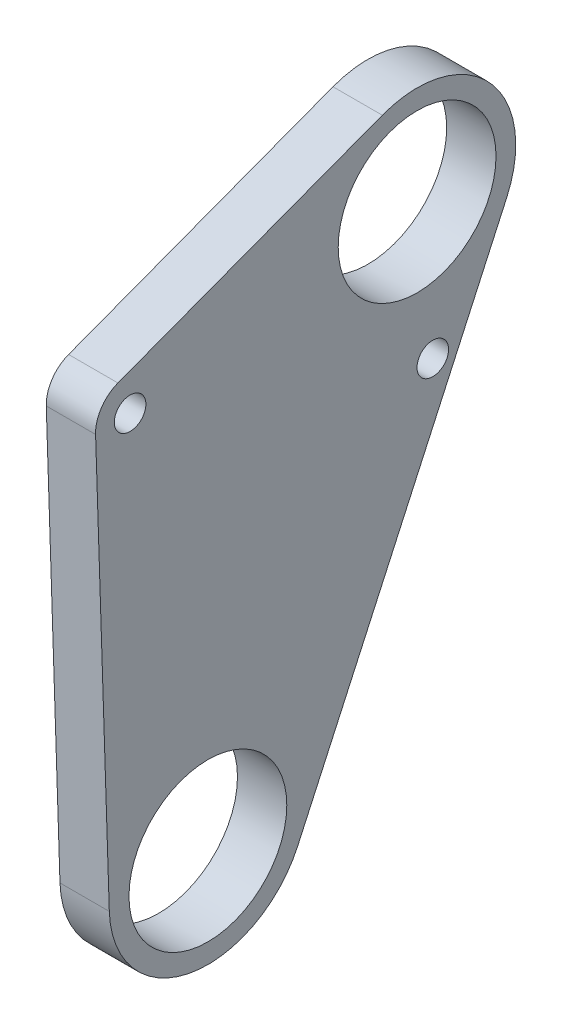
ISO-10303-21;
HEADER;
FILE_DESCRIPTION(('STEP AP214'),'2;1');
FILE_NAME('part.step','',(''),(''),'','','');
FILE_SCHEMA(('AUTOMOTIVE_DESIGN { 1 0 10303 214 1 1 1 1 }'));
ENDSEC;
DATA;
#1=APPLICATION_CONTEXT('core data for automotive mechanical design processes');
#2=APPLICATION_PROTOCOL_DEFINITION('international standard','automotive_design',2000,#1);
#3=PRODUCT_CONTEXT('',#1,'mechanical');
#4=PRODUCT('Part','Part','',(#3));
#5=PRODUCT_RELATED_PRODUCT_CATEGORY('part','',(#4));
#6=PRODUCT_DEFINITION_FORMATION('','',#4);
#7=PRODUCT_DEFINITION_CONTEXT('part definition',#1,'design');
#8=PRODUCT_DEFINITION('design','',#6,#7);
#9=PRODUCT_DEFINITION_SHAPE('','',#8);
#10=(LENGTH_UNIT() NAMED_UNIT(*) SI_UNIT(.MILLI.,.METRE.));
#11=(NAMED_UNIT(*) PLANE_ANGLE_UNIT() SI_UNIT($,.RADIAN.));
#12=(NAMED_UNIT(*) SI_UNIT($,.STERADIAN.) SOLID_ANGLE_UNIT());
#13=UNCERTAINTY_MEASURE_WITH_UNIT(LENGTH_MEASURE(1.E-05),#10,'distance_accuracy_value','');
#14=(GEOMETRIC_REPRESENTATION_CONTEXT(3) GLOBAL_UNCERTAINTY_ASSIGNED_CONTEXT((#13)) GLOBAL_UNIT_ASSIGNED_CONTEXT((#10,
#11,#12)) REPRESENTATION_CONTEXT('',''));
#15=CARTESIAN_POINT('',(0.,0.,0.));
#16=DIRECTION('',(0.,0.,1.));
#17=DIRECTION('',(1.,0.,0.));
#18=AXIS2_PLACEMENT_3D('',#15,#16,#17);
#19=CARTESIAN_POINT('',(-16.3,0.,0.));
#20=DIRECTION('',(-1.,0.,0.));
#21=DIRECTION('',(0.,0.,1.));
#22=AXIS2_PLACEMENT_3D('',#19,#20,#21);
#23=PLANE('',#22);
#24=CARTESIAN_POINT('',(-16.3,-46.3798085110589,21.2111612713096));
#25=DIRECTION('',(-1.,0.,0.));
#26=DIRECTION('',(0.,0.,1.));
#27=AXIS2_PLACEMENT_3D('',#24,#25,#26);
#28=CIRCLE('',#27,8.00000000000001);
#29=CARTESIAN_POINT('',(-16.3,-46.3798085110589,29.2111612713096));
#30=VERTEX_POINT('',#29);
#31=EDGE_CURVE('E65',#30,#30,#28,.F.);
#32=ORIENTED_EDGE('',*,*,#31,.F.);
#33=EDGE_LOOP('',(#32));
#34=FACE_BOUND('',#33,.T.);
#35=CARTESIAN_POINT('',(-16.3,0.,0.));
#36=DIRECTION('',(-1.,0.,0.));
#37=DIRECTION('',(0.,0.,1.));
#38=AXIS2_PLACEMENT_3D('',#35,#36,#37);
#39=CIRCLE('',#38,8.00000000000078);
#40=CARTESIAN_POINT('',(-16.3,0.,8.00000000000078));
#41=VERTEX_POINT('',#40);
#42=EDGE_CURVE('E265',#41,#41,#39,.F.);
#43=ORIENTED_EDGE('',*,*,#42,.F.);
#44=EDGE_LOOP('',(#43));
#45=FACE_BOUND('',#44,.T.);
#46=CARTESIAN_POINT('',(-16.3,0.,0.));
#47=DIRECTION('',(-1.,0.,0.));
#48=DIRECTION('',(0.,0.,1.));
#49=AXIS2_PLACEMENT_3D('',#46,#47,#48);
#50=CIRCLE('',#49,10.0000000000004);
#51=CARTESIAN_POINT('',(-16.3,-4.15905122966853,-9.09408010020763));
#52=VERTEX_POINT('',#51);
#53=CARTESIAN_POINT('',(-16.3,9.3573851667248,3.52694525638814));
#54=VERTEX_POINT('',#53);
#55=EDGE_CURVE('E259',#52,#54,#50,.F.);
#56=ORIENTED_EDGE('',*,*,#55,.T.);
#57=DIRECTION('',(0.,-0.352694525638813,0.93573851667248));
#58=VECTOR('',#57,1.);
#59=CARTESIAN_POINT('',(-16.3,9.3573851667248,3.52694525638814));
#60=LINE('',#59,#58);
#61=CARTESIAN_POINT('',(-16.3,-0.745905163491184,30.3321186283995));
#62=VERTEX_POINT('',#61);
#63=EDGE_CURVE('E70',#54,#62,#60,.T.);
#64=ORIENTED_EDGE('',*,*,#63,.T.);
#65=CARTESIAN_POINT('',(-16.3,-4.02098997184533,29.0976877886635));
#66=DIRECTION('',(-1.,0.,0.));
#67=DIRECTION('',(0.,0.,1.));
#68=AXIS2_PLACEMENT_3D('',#65,#66,#67);
#69=CIRCLE('',#68,3.50000000000049);
#70=CARTESIAN_POINT('',(-16.3,-4.13520800486961,32.5958236123467));
#71=VERTEX_POINT('',#70);
#72=EDGE_CURVE('E12',#62,#71,#69,.F.);
#73=ORIENTED_EDGE('',*,*,#72,.T.);
#74=DIRECTION('',(0.,0.99946737819505,0.0326337237212191));
#75=VECTOR('',#74,1.);
#76=CARTESIAN_POINT('',(-16.3,-1.06756037091446,32.6959857262331));
#77=LINE('',#76,#75);
#78=CARTESIAN_POINT('',(-16.3,-46.7061457482711,31.2058350532601));
#79=VERTEX_POINT('',#78);
#80=EDGE_CURVE('E84',#79,#71,#77,.T.);
#81=ORIENTED_EDGE('',*,*,#80,.F.);
#82=CARTESIAN_POINT('',(-16.3,-46.3798085110589,21.2111612713096));
#83=DIRECTION('',(-1.,0.,0.));
#84=DIRECTION('',(0.,0.,1.));
#85=AXIS2_PLACEMENT_3D('',#82,#83,#84);
#86=CIRCLE('',#85,10.);
#87=CARTESIAN_POINT('',(-16.3,-50.5388597407275,12.1170811711019));
#88=VERTEX_POINT('',#87);
#89=EDGE_CURVE('E262',#79,#88,#86,.F.);
#90=ORIENTED_EDGE('',*,*,#89,.T.);
#91=DIRECTION('',(0.,-0.909408010020764,0.415905122966855));
#92=VECTOR('',#91,1.);
#93=CARTESIAN_POINT('',(-16.3,-4.15905122966854,-9.09408010020762));
#94=LINE('',#93,#92);
#95=EDGE_CURVE('E257',#52,#88,#94,.T.);
#96=ORIENTED_EDGE('',*,*,#95,.F.);
#97=EDGE_LOOP('',(#56,#64,#73,#81,#90,#96));
#98=FACE_BOUND('',#97,.T.);
#99=CARTESIAN_POINT('',(-16.3,-4.02098997184533,29.0976877886635));
#100=DIRECTION('',(-1.,0.,0.));
#101=DIRECTION('',(0.,0.,1.));
#102=AXIS2_PLACEMENT_3D('',#99,#100,#101);
#103=CIRCLE('',#102,1.59999999999999);
#104=CARTESIAN_POINT('',(-16.3,-4.02098997184533,30.6976877886635));
#105=VERTEX_POINT('',#104);
#106=EDGE_CURVE('E253',#105,#105,#103,.F.);
#107=ORIENTED_EDGE('',*,*,#106,.F.);
#108=EDGE_LOOP('',(#107));
#109=FACE_BOUND('',#108,.T.);
#110=CARTESIAN_POINT('',(-16.3,-14.554297085467,-1.59091767944725));
#111=DIRECTION('',(-1.,0.,0.));
#112=DIRECTION('',(0.,0.,1.));
#113=AXIS2_PLACEMENT_3D('',#110,#111,#112);
#114=CIRCLE('',#113,1.6);
#115=CARTESIAN_POINT('',(-16.3,-14.554297085467,0.00908232055274634));
#116=VERTEX_POINT('',#115);
#117=EDGE_CURVE('E248',#116,#116,#114,.F.);
#118=ORIENTED_EDGE('',*,*,#117,.F.);
#119=EDGE_LOOP('',(#118));
#120=FACE_BOUND('',#119,.T.);
#121=ADVANCED_FACE('F62',(#34,#45,#98,#109,#120),#23,.F.);
#122=CARTESIAN_POINT('',(-20.3,-16.4542478421911,0.471947030409549));
#123=DIRECTION('',(-1.,0.,0.));
#124=DIRECTION('',(0.,0.,-1.));
#125=AXIS2_PLACEMENT_3D('',#122,#123,#124);
#126=CYLINDRICAL_SURFACE('',#125,2.);
#127=CARTESIAN_POINT('',(-21.3,-16.4542478421911,0.471947030409549));
#128=DIRECTION('',(1.,0.,0.));
#129=DIRECTION('',(0.,0.,-1.));
#130=AXIS2_PLACEMENT_3D('',#127,#128,#129);
#131=CIRCLE('',#130,2.);
#132=CARTESIAN_POINT('',(-21.3,-14.5799720351289,1.16986550635146));
#133=VERTEX_POINT('',#132);
#134=CARTESIAN_POINT('',(-21.3,-18.3285236492534,-0.225971445532369));
#135=VERTEX_POINT('',#134);
#136=EDGE_CURVE('E167',#133,#135,#131,.T.);
#137=ORIENTED_EDGE('',*,*,#136,.F.);
#138=DIRECTION('',(-1.,0.,0.));
#139=VECTOR('',#138,1.);
#140=CARTESIAN_POINT('',(-20.3,-14.5799720351289,1.16986550635146));
#141=LINE('',#140,#139);
#142=CARTESIAN_POINT('',(-20.3,-14.5799720351289,1.16986550635146));
#143=VERTEX_POINT('',#142);
#144=EDGE_CURVE('E164',#143,#133,#141,.T.);
#145=ORIENTED_EDGE('',*,*,#144,.F.);
#146=CARTESIAN_POINT('',(-20.3,-16.4542478421911,0.471947030409549));
#147=DIRECTION('',(1.,0.,0.));
#148=DIRECTION('',(0.,0.,-1.));
#149=AXIS2_PLACEMENT_3D('',#146,#147,#148);
#150=CIRCLE('',#149,2.);
#151=CARTESIAN_POINT('',(-20.3,-18.3285236492534,-0.225971445532369));
#152=VERTEX_POINT('',#151);
#153=EDGE_CURVE('E151',#143,#152,#150,.T.);
#154=ORIENTED_EDGE('',*,*,#153,.T.);
#155=DIRECTION('',(-1.,0.,0.));
#156=VECTOR('',#155,1.);
#157=CARTESIAN_POINT('',(-20.3,-18.3285236492534,-0.225971445532369));
#158=LINE('',#157,#156);
#159=EDGE_CURVE('E171',#152,#135,#158,.T.);
#160=ORIENTED_EDGE('',*,*,#159,.T.);
#161=EDGE_LOOP('',(#137,#145,#154,#160));
#162=FACE_BOUND('',#161,.T.);
#163=ADVANCED_FACE('F165',(#162),#126,.F.);
#164=CARTESIAN_POINT('',(-20.3,-11.7511780450292,-1.67893662220493));
#165=DIRECTION('',(-1.,0.,0.));
#166=DIRECTION('',(0.,0.,-1.));
#167=AXIS2_PLACEMENT_3D('',#164,#165,#166);
#168=CYLINDRICAL_SURFACE('',#167,2.);
#169=CARTESIAN_POINT('',(-21.3,-11.7511780450292,-1.67893662220493));
#170=DIRECTION('',(1.,0.,0.));
#171=DIRECTION('',(0.,0.,-1.));
#172=AXIS2_PLACEMENT_3D('',#169,#170,#171);
#173=CIRCLE('',#172,2.);
#174=CARTESIAN_POINT('',(-21.3,-12.4490965209711,0.195339184857335));
#175=VERTEX_POINT('',#174);
#176=CARTESIAN_POINT('',(-21.3,-11.0532595690873,-3.5532124292672));
#177=VERTEX_POINT('',#176);
#178=EDGE_CURVE('E176',#175,#177,#173,.F.);
#179=ORIENTED_EDGE('',*,*,#178,.T.);
#180=DIRECTION('',(-1.,0.,0.));
#181=VECTOR('',#180,1.);
#182=CARTESIAN_POINT('',(-20.3,-11.0532595690873,-3.5532124292672));
#183=LINE('',#182,#181);
#184=CARTESIAN_POINT('',(-20.3,-11.0532595690873,-3.5532124292672));
#185=VERTEX_POINT('',#184);
#186=EDGE_CURVE('E201',#185,#177,#183,.T.);
#187=ORIENTED_EDGE('',*,*,#186,.F.);
#188=CARTESIAN_POINT('',(-20.3,-11.7511780450292,-1.67893662220493));
#189=DIRECTION('',(1.,0.,0.));
#190=DIRECTION('',(0.,0.,-1.));
#191=AXIS2_PLACEMENT_3D('',#188,#189,#190);
#192=CIRCLE('',#191,2.);
#193=CARTESIAN_POINT('',(-20.3,-12.4490965209711,0.195339184857335));
#194=VERTEX_POINT('',#193);
#195=EDGE_CURVE('E172',#194,#185,#192,.F.);
#196=ORIENTED_EDGE('',*,*,#195,.F.);
#197=DIRECTION('',(-1.,0.,0.));
#198=VECTOR('',#197,1.);
#199=CARTESIAN_POINT('',(-20.3,-12.4490965209711,0.195339184857335));
#200=LINE('',#199,#198);
#201=EDGE_CURVE('E175',#194,#175,#200,.T.);
#202=ORIENTED_EDGE('',*,*,#201,.T.);
#203=EDGE_LOOP('',(#179,#187,#196,#202));
#204=FACE_BOUND('',#203,.T.);
#205=ADVANCED_FACE('F367',(#204),#168,.F.);
#206=CARTESIAN_POINT('',(-20.3,-2.0795256148345,-4.54704005010432));
#207=DIRECTION('',(0.,-0.415905122966854,-0.909408010020764));
#208=DIRECTION('',(0.,0.909408010020764,-0.415905122966854));
#209=AXIS2_PLACEMENT_3D('',#206,#207,#208);
#210=PLANE('',#209);
#211=DIRECTION('',(0.,0.909408010020764,-0.415905122966854));
#212=VECTOR('',#211,1.);
#213=CARTESIAN_POINT('',(-21.3,-2.0795256148345,-4.54704005010432));
#214=LINE('',#213,#212);
#215=EDGE_CURVE('E191',#133,#175,#214,.T.);
#216=ORIENTED_EDGE('',*,*,#215,.T.);
#217=ORIENTED_EDGE('',*,*,#201,.F.);
#218=DIRECTION('',(0.,0.909408010020764,-0.415905122966854));
#219=VECTOR('',#218,1.);
#220=CARTESIAN_POINT('',(-20.3,-2.0795256148345,-4.54704005010432));
#221=LINE('',#220,#219);
#222=EDGE_CURVE('E156',#143,#194,#221,.T.);
#223=ORIENTED_EDGE('',*,*,#222,.F.);
#224=ORIENTED_EDGE('',*,*,#144,.T.);
#225=EDGE_LOOP('',(#216,#217,#223,#224));
#226=FACE_BOUND('',#225,.T.);
#227=ADVANCED_FACE('F174',(#226),#210,.T.);
#228=CARTESIAN_POINT('',(-20.3,-7.79737662313245,3.56602190384131));
#229=DIRECTION('',(0.,0.909408010020764,-0.415905122966855));
#230=DIRECTION('',(0.,0.415905122966855,0.909408010020764));
#231=AXIS2_PLACEMENT_3D('',#228,#229,#230);
#232=PLANE('',#231);
#233=DIRECTION('',(0.,0.415905122966855,0.909408010020764));
#234=VECTOR('',#233,1.);
#235=CARTESIAN_POINT('',(-21.3,-7.79737662313245,3.56602190384131));
#236=LINE('',#235,#234);
#237=CARTESIAN_POINT('',(-21.3,-11.956427852801,-5.52805819636632));
#238=VERTEX_POINT('',#237);
#239=EDGE_CURVE('E179',#238,#177,#236,.T.);
#240=ORIENTED_EDGE('',*,*,#239,.F.);
#241=DIRECTION('',(-1.,0.,0.));
#242=VECTOR('',#241,1.);
#243=CARTESIAN_POINT('',(-20.3,-11.956427852801,-5.52805819636632));
#244=LINE('',#243,#242);
#245=CARTESIAN_POINT('',(-20.3,-11.956427852801,-5.52805819636632));
#246=VERTEX_POINT('',#245);
#247=EDGE_CURVE('E203',#246,#238,#244,.T.);
#248=ORIENTED_EDGE('',*,*,#247,.F.);
#249=DIRECTION('',(0.,0.415905122966855,0.909408010020764));
#250=VECTOR('',#249,1.);
#251=CARTESIAN_POINT('',(-20.3,-7.79737662313245,3.56602190384131));
#252=LINE('',#251,#250);
#253=EDGE_CURVE('E188',#246,#185,#252,.T.);
#254=ORIENTED_EDGE('',*,*,#253,.T.);
#255=ORIENTED_EDGE('',*,*,#186,.T.);
#256=EDGE_LOOP('',(#240,#248,#254,#255));
#257=FACE_BOUND('',#256,.T.);
#258=ADVANCED_FACE('F366',(#257),#232,.F.);
#259=CARTESIAN_POINT('',(-20.3,0.,0.));
#260=DIRECTION('',(-1.,0.,0.));
#261=DIRECTION('',(0.,0.,-1.));
#262=AXIS2_PLACEMENT_3D('',#259,#260,#261);
#263=PLANE('',#262);
#264=CARTESIAN_POINT('',(-20.3,-14.554297085467,-1.59091767944725));
#265=DIRECTION('',(1.,0.,0.));
#266=DIRECTION('',(0.,0.,-1.));
#267=AXIS2_PLACEMENT_3D('',#264,#265,#266);
#268=CIRCLE('',#267,1.6);
#269=CARTESIAN_POINT('',(-20.3,-14.554297085467,-3.19091767944725));
#270=VERTEX_POINT('',#269);
#271=EDGE_CURVE('E291',#270,#270,#268,.T.);
#272=ORIENTED_EDGE('',*,*,#271,.T.);
#273=EDGE_LOOP('',(#272));
#274=FACE_BOUND('',#273,.T.);
#275=ORIENTED_EDGE('',*,*,#222,.T.);
#276=ORIENTED_EDGE('',*,*,#195,.T.);
#277=ORIENTED_EDGE('',*,*,#253,.F.);
#278=DIRECTION('',(0.,-0.909408010020764,0.415905122966855));
#279=VECTOR('',#278,1.);
#280=CARTESIAN_POINT('',(-20.3,-4.15905122966854,-9.09408010020762));
#281=LINE('',#280,#279);
#282=CARTESIAN_POINT('',(-20.3,-19.2316919329671,-2.20081721263149));
#283=VERTEX_POINT('',#282);
#284=EDGE_CURVE('E186',#246,#283,#281,.T.);
#285=ORIENTED_EDGE('',*,*,#284,.T.);
#286=DIRECTION('',(0.,0.415905122966858,0.909408010020762));
#287=VECTOR('',#286,1.);
#288=CARTESIAN_POINT('',(-20.3,-15.0726407032985,6.89326288757617));
#289=LINE('',#288,#287);
#290=EDGE_CURVE('E159',#283,#152,#289,.T.);
#291=ORIENTED_EDGE('',*,*,#290,.T.);
#292=ORIENTED_EDGE('',*,*,#153,.F.);
#293=EDGE_LOOP('',(#275,#276,#277,#285,#291,#292));
#294=FACE_BOUND('',#293,.T.);
#295=ADVANCED_FACE('F153',(#274,#294),#263,.T.);
#296=CARTESIAN_POINT('',(-16.3,-14.554297085467,-1.59091767944725));
#297=DIRECTION('',(-1.,0.,0.));
#298=DIRECTION('',(0.,0.,1.));
#299=AXIS2_PLACEMENT_3D('',#296,#297,#298);
#300=CYLINDRICAL_SURFACE('',#299,1.6);
#301=ORIENTED_EDGE('',*,*,#117,.T.);
#302=EDGE_LOOP('',(#301));
#303=FACE_BOUND('',#302,.T.);
#304=ORIENTED_EDGE('',*,*,#271,.F.);
#305=EDGE_LOOP('',(#304));
#306=FACE_BOUND('',#305,.T.);
#307=ADVANCED_FACE('F284',(#303,#306),#300,.F.);
#308=CARTESIAN_POINT('',(-20.3,-15.0726407032985,6.89326288757617));
#309=DIRECTION('',(0.,0.909408010020762,-0.415905122966858));
#310=DIRECTION('',(0.,0.415905122966858,0.909408010020762));
#311=AXIS2_PLACEMENT_3D('',#308,#309,#310);
#312=PLANE('',#311);
#313=DIRECTION('',(0.,0.415905122966858,0.909408010020762));
#314=VECTOR('',#313,1.);
#315=CARTESIAN_POINT('',(-21.3,-15.0726407032985,6.89326288757617));
#316=LINE('',#315,#314);
#317=CARTESIAN_POINT('',(-21.3,-19.2316919329671,-2.20081721263149));
#318=VERTEX_POINT('',#317);
#319=EDGE_CURVE('E194',#318,#135,#316,.T.);
#320=ORIENTED_EDGE('',*,*,#319,.T.);
#321=ORIENTED_EDGE('',*,*,#159,.F.);
#322=ORIENTED_EDGE('',*,*,#290,.F.);
#323=DIRECTION('',(-1.,0.,0.));
#324=VECTOR('',#323,1.);
#325=CARTESIAN_POINT('',(-20.3,-19.2316919329671,-2.20081721263149));
#326=LINE('',#325,#324);
#327=EDGE_CURVE('E206',#283,#318,#326,.T.);
#328=ORIENTED_EDGE('',*,*,#327,.T.);
#329=EDGE_LOOP('',(#320,#321,#322,#328));
#330=FACE_BOUND('',#329,.T.);
#331=ADVANCED_FACE('F287',(#330),#312,.T.);
#332=CARTESIAN_POINT('',(-16.3,0.,0.));
#333=DIRECTION('',(1.,0.,0.));
#334=DIRECTION('',(0.,0.,-1.));
#335=AXIS2_PLACEMENT_3D('',#332,#333,#334);
#336=CYLINDRICAL_SURFACE('',#335,10.0000000000004);
#337=ORIENTED_EDGE('',*,*,#55,.F.);
#338=DIRECTION('',(1.,0.,0.));
#339=VECTOR('',#338,1.);
#340=CARTESIAN_POINT('',(-16.3,-4.15905122966853,-9.09408010020763));
#341=LINE('',#340,#339);
#342=CARTESIAN_POINT('',(-21.3,-4.15905122966853,-9.09408010020763));
#343=VERTEX_POINT('',#342);
#344=EDGE_CURVE('E245',#343,#52,#341,.T.);
#345=ORIENTED_EDGE('',*,*,#344,.F.);
#346=CARTESIAN_POINT('',(-21.3,0.,0.));
#347=DIRECTION('',(1.,0.,0.));
#348=DIRECTION('',(0.,0.,-1.));
#349=AXIS2_PLACEMENT_3D('',#346,#347,#348);
#350=CIRCLE('',#349,10.0000000000004);
#351=CARTESIAN_POINT('',(-21.3,9.3573851667248,3.52694525638814));
#352=VERTEX_POINT('',#351);
#353=EDGE_CURVE('E231',#343,#352,#350,.T.);
#354=ORIENTED_EDGE('',*,*,#353,.T.);
#355=DIRECTION('',(1.,0.,0.));
#356=VECTOR('',#355,1.);
#357=CARTESIAN_POINT('',(-16.3,9.3573851667248,3.52694525638814));
#358=LINE('',#357,#356);
#359=EDGE_CURVE('E235',#352,#54,#358,.T.);
#360=ORIENTED_EDGE('',*,*,#359,.T.);
#361=EDGE_LOOP('',(#337,#345,#354,#360));
#362=FACE_BOUND('',#361,.T.);
#363=ADVANCED_FACE('F320',(#362),#336,.T.);
#364=CARTESIAN_POINT('',(-16.3,-46.3798085110589,21.2111612713096));
#365=DIRECTION('',(1.,0.,0.));
#366=DIRECTION('',(0.,0.,-1.));
#367=AXIS2_PLACEMENT_3D('',#364,#365,#366);
#368=CYLINDRICAL_SURFACE('',#367,10.);
#369=ORIENTED_EDGE('',*,*,#89,.F.);
#370=DIRECTION('',(1.,0.,0.));
#371=VECTOR('',#370,1.);
#372=CARTESIAN_POINT('',(-16.3,-46.7061457482711,31.2058350532601));
#373=LINE('',#372,#371);
#374=CARTESIAN_POINT('',(-21.3,-46.7061457482711,31.2058350532601));
#375=VERTEX_POINT('',#374);
#376=EDGE_CURVE('E239',#375,#79,#373,.T.);
#377=ORIENTED_EDGE('',*,*,#376,.F.);
#378=CARTESIAN_POINT('',(-21.3,-46.3798085110589,21.2111612713096));
#379=DIRECTION('',(1.,0.,0.));
#380=DIRECTION('',(0.,0.,-1.));
#381=AXIS2_PLACEMENT_3D('',#378,#379,#380);
#382=CIRCLE('',#381,10.);
#383=CARTESIAN_POINT('',(-21.3,-50.5388597407275,12.1170811711019));
#384=VERTEX_POINT('',#383);
#385=EDGE_CURVE('E224',#375,#384,#382,.T.);
#386=ORIENTED_EDGE('',*,*,#385,.T.);
#387=DIRECTION('',(1.,0.,0.));
#388=VECTOR('',#387,1.);
#389=CARTESIAN_POINT('',(-16.3,-50.5388597407275,12.1170811711019));
#390=LINE('',#389,#388);
#391=EDGE_CURVE('E238',#384,#88,#390,.T.);
#392=ORIENTED_EDGE('',*,*,#391,.T.);
#393=EDGE_LOOP('',(#369,#377,#386,#392));
#394=FACE_BOUND('',#393,.T.);
#395=ADVANCED_FACE('F316',(#394),#368,.T.);
#396=CARTESIAN_POINT('',(-16.3,-1.06756037091446,32.6959857262331));
#397=DIRECTION('',(0.,0.0326337237212191,-0.99946737819505));
#398=DIRECTION('',(0.,0.99946737819505,0.0326337237212191));
#399=AXIS2_PLACEMENT_3D('',#396,#397,#398);
#400=PLANE('',#399);
#401=ORIENTED_EDGE('',*,*,#376,.T.);
#402=ORIENTED_EDGE('',*,*,#80,.T.);
#403=DIRECTION('',(1.,0.,0.));
#404=VECTOR('',#403,1.);
#405=CARTESIAN_POINT('',(-16.3,-4.13520800486961,32.5958236123467));
#406=LINE('',#405,#404);
#407=CARTESIAN_POINT('',(-21.3,-4.13520800486961,32.5958236123467));
#408=VERTEX_POINT('',#407);
#409=EDGE_CURVE('E241',#408,#71,#406,.T.);
#410=ORIENTED_EDGE('',*,*,#409,.F.);
#411=DIRECTION('',(0.,0.99946737819505,0.0326337237212191));
#412=VECTOR('',#411,1.);
#413=CARTESIAN_POINT('',(-21.3,-1.06756037091446,32.6959857262331));
#414=LINE('',#413,#412);
#415=EDGE_CURVE('E215',#375,#408,#414,.T.);
#416=ORIENTED_EDGE('',*,*,#415,.F.);
#417=EDGE_LOOP('',(#401,#402,#410,#416));
#418=FACE_BOUND('',#417,.T.);
#419=ADVANCED_FACE('F311',(#418),#400,.F.);
#420=CARTESIAN_POINT('',(-21.3,0.,0.));
#421=DIRECTION('',(-1.,0.,0.));
#422=DIRECTION('',(0.,0.,-1.));
#423=AXIS2_PLACEMENT_3D('',#420,#421,#422);
#424=PLANE('',#423);
#425=CARTESIAN_POINT('',(-21.3,-4.02098997184533,29.0976877886635));
#426=DIRECTION('',(1.,0.,0.));
#427=DIRECTION('',(0.,0.,-1.));
#428=AXIS2_PLACEMENT_3D('',#425,#426,#427);
#429=CIRCLE('',#428,1.59999999999999);
#430=CARTESIAN_POINT('',(-21.3,-4.02098997184533,27.4976877886635));
#431=VERTEX_POINT('',#430);
#432=EDGE_CURVE('E182',#431,#431,#429,.T.);
#433=ORIENTED_EDGE('',*,*,#432,.T.);
#434=EDGE_LOOP('',(#433));
#435=FACE_BOUND('',#434,.T.);
#436=ORIENTED_EDGE('',*,*,#239,.T.);
#437=ORIENTED_EDGE('',*,*,#178,.F.);
#438=ORIENTED_EDGE('',*,*,#215,.F.);
#439=ORIENTED_EDGE('',*,*,#136,.T.);
#440=ORIENTED_EDGE('',*,*,#319,.F.);
#441=DIRECTION('',(0.,-0.909408010020764,0.415905122966855));
#442=VECTOR('',#441,1.);
#443=CARTESIAN_POINT('',(-21.3,-4.15905122966854,-9.09408010020762));
#444=LINE('',#443,#442);
#445=EDGE_CURVE('E227',#318,#384,#444,.T.);
#446=ORIENTED_EDGE('',*,*,#445,.T.);
#447=ORIENTED_EDGE('',*,*,#385,.F.);
#448=ORIENTED_EDGE('',*,*,#415,.T.);
#449=CARTESIAN_POINT('',(-21.3,-4.02098997184533,29.0976877886635));
#450=DIRECTION('',(1.,0.,0.));
#451=DIRECTION('',(0.,0.,-1.));
#452=AXIS2_PLACEMENT_3D('',#449,#450,#451);
#453=CIRCLE('',#452,3.50000000000049);
#454=CARTESIAN_POINT('',(-21.3,-0.745905163491184,30.3321186283995));
#455=VERTEX_POINT('',#454);
#456=EDGE_CURVE('E212',#455,#408,#453,.T.);
#457=ORIENTED_EDGE('',*,*,#456,.F.);
#458=DIRECTION('',(0.,-0.352694525638813,0.93573851667248));
#459=VECTOR('',#458,1.);
#460=CARTESIAN_POINT('',(-21.3,9.3573851667248,3.52694525638814));
#461=LINE('',#460,#459);
#462=EDGE_CURVE('E200',#352,#455,#461,.T.);
#463=ORIENTED_EDGE('',*,*,#462,.F.);
#464=ORIENTED_EDGE('',*,*,#353,.F.);
#465=EDGE_CURVE('E228',#343,#238,#444,.T.);
#466=ORIENTED_EDGE('',*,*,#465,.T.);
#467=EDGE_LOOP('',(#436,#437,#438,#439,#440,#446,#447,#448,#457,#463,#464,#466));
#468=FACE_BOUND('',#467,.T.);
#469=CARTESIAN_POINT('',(-21.3,0.,0.));
#470=DIRECTION('',(1.,0.,0.));
#471=DIRECTION('',(0.,0.,-1.));
#472=AXIS2_PLACEMENT_3D('',#469,#470,#471);
#473=CIRCLE('',#472,8.00000000000078);
#474=CARTESIAN_POINT('',(-21.3,0.,-8.00000000000078));
#475=VERTEX_POINT('',#474);
#476=EDGE_CURVE('E218',#475,#475,#473,.T.);
#477=ORIENTED_EDGE('',*,*,#476,.T.);
#478=EDGE_LOOP('',(#477));
#479=FACE_BOUND('',#478,.T.);
#480=CARTESIAN_POINT('',(-21.3,-46.3798085110589,21.2111612713096));
#481=DIRECTION('',(1.,0.,0.));
#482=DIRECTION('',(0.,0.,-1.));
#483=AXIS2_PLACEMENT_3D('',#480,#481,#482);
#484=CIRCLE('',#483,8.00000000000001);
#485=CARTESIAN_POINT('',(-21.3,-46.3798085110589,13.2111612713096));
#486=VERTEX_POINT('',#485);
#487=EDGE_CURVE('E221',#486,#486,#484,.T.);
#488=ORIENTED_EDGE('',*,*,#487,.T.);
#489=EDGE_LOOP('',(#488));
#490=FACE_BOUND('',#489,.T.);
#491=ADVANCED_FACE('F296',(#435,#468,#479,#490),#424,.T.);
#492=CARTESIAN_POINT('',(-11.3,-4.02098997184533,29.0976877886635));
#493=DIRECTION('',(1.,0.,0.));
#494=DIRECTION('',(0.,0.,-1.));
#495=AXIS2_PLACEMENT_3D('',#492,#493,#494);
#496=CYLINDRICAL_SURFACE('',#495,1.59999999999999);
#497=ORIENTED_EDGE('',*,*,#106,.T.);
#498=EDGE_LOOP('',(#497));
#499=FACE_BOUND('',#498,.T.);
#500=ORIENTED_EDGE('',*,*,#432,.F.);
#501=EDGE_LOOP('',(#500));
#502=FACE_BOUND('',#501,.T.);
#503=ADVANCED_FACE('F299',(#499,#502),#496,.F.);
#504=CARTESIAN_POINT('',(-16.3,9.3573851667248,3.52694525638814));
#505=DIRECTION('',(0.,0.93573851667248,0.352694525638813));
#506=DIRECTION('',(0.,-0.352694525638813,0.93573851667248));
#507=AXIS2_PLACEMENT_3D('',#504,#505,#506);
#508=PLANE('',#507);
#509=ORIENTED_EDGE('',*,*,#63,.F.);
#510=ORIENTED_EDGE('',*,*,#359,.F.);
#511=ORIENTED_EDGE('',*,*,#462,.T.);
#512=DIRECTION('',(1.,0.,0.));
#513=VECTOR('',#512,1.);
#514=CARTESIAN_POINT('',(-16.3,-0.745905163491184,30.3321186283995));
#515=LINE('',#514,#513);
#516=EDGE_CURVE('E234',#455,#62,#515,.T.);
#517=ORIENTED_EDGE('',*,*,#516,.T.);
#518=EDGE_LOOP('',(#509,#510,#511,#517));
#519=FACE_BOUND('',#518,.T.);
#520=ADVANCED_FACE('F301',(#519),#508,.T.);
#521=CARTESIAN_POINT('',(-16.3,-4.02098997184533,29.0976877886635));
#522=DIRECTION('',(1.,0.,0.));
#523=DIRECTION('',(0.,0.,-1.));
#524=AXIS2_PLACEMENT_3D('',#521,#522,#523);
#525=CYLINDRICAL_SURFACE('',#524,3.50000000000049);
#526=ORIENTED_EDGE('',*,*,#72,.F.);
#527=ORIENTED_EDGE('',*,*,#516,.F.);
#528=ORIENTED_EDGE('',*,*,#456,.T.);
#529=ORIENTED_EDGE('',*,*,#409,.T.);
#530=EDGE_LOOP('',(#526,#527,#528,#529));
#531=FACE_BOUND('',#530,.T.);
#532=ADVANCED_FACE('F308',(#531),#525,.T.);
#533=CARTESIAN_POINT('',(-16.3,-4.15905122966854,-9.09408010020762));
#534=DIRECTION('',(0.,0.415905122966854,0.909408010020764));
#535=DIRECTION('',(0.,-0.909408010020764,0.415905122966855));
#536=AXIS2_PLACEMENT_3D('',#533,#534,#535);
#537=PLANE('',#536);
#538=ORIENTED_EDGE('',*,*,#344,.T.);
#539=ORIENTED_EDGE('',*,*,#95,.T.);
#540=ORIENTED_EDGE('',*,*,#391,.F.);
#541=ORIENTED_EDGE('',*,*,#445,.F.);
#542=ORIENTED_EDGE('',*,*,#327,.F.);
#543=ORIENTED_EDGE('',*,*,#284,.F.);
#544=ORIENTED_EDGE('',*,*,#247,.T.);
#545=ORIENTED_EDGE('',*,*,#465,.F.);
#546=EDGE_LOOP('',(#538,#539,#540,#541,#542,#543,#544,#545));
#547=FACE_BOUND('',#546,.T.);
#548=ADVANCED_FACE('F318',(#547),#537,.F.);
#549=CARTESIAN_POINT('',(-16.3,0.,0.));
#550=DIRECTION('',(1.,0.,0.));
#551=DIRECTION('',(0.,0.,-1.));
#552=AXIS2_PLACEMENT_3D('',#549,#550,#551);
#553=CYLINDRICAL_SURFACE('',#552,8.00000000000078);
#554=ORIENTED_EDGE('',*,*,#42,.T.);
#555=EDGE_LOOP('',(#554));
#556=FACE_BOUND('',#555,.T.);
#557=ORIENTED_EDGE('',*,*,#476,.F.);
#558=EDGE_LOOP('',(#557));
#559=FACE_BOUND('',#558,.T.);
#560=ADVANCED_FACE('F326',(#556,#559),#553,.F.);
#561=CARTESIAN_POINT('',(-16.3,-46.3798085110589,21.2111612713096));
#562=DIRECTION('',(1.,0.,0.));
#563=DIRECTION('',(0.,0.,-1.));
#564=AXIS2_PLACEMENT_3D('',#561,#562,#563);
#565=CYLINDRICAL_SURFACE('',#564,8.00000000000001);
#566=ORIENTED_EDGE('',*,*,#31,.T.);
#567=EDGE_LOOP('',(#566));
#568=FACE_BOUND('',#567,.T.);
#569=ORIENTED_EDGE('',*,*,#487,.F.);
#570=EDGE_LOOP('',(#569));
#571=FACE_BOUND('',#570,.T.);
#572=ADVANCED_FACE('F272',(#568,#571),#565,.F.);
#573=CLOSED_SHELL('',(#121,#163,#205,#227,#258,#295,#307,#331,#363,#395,#419,#491,#503,#520,
#532,#548,#560,#572));
#574=MANIFOLD_SOLID_BREP('B2',#573);
#575=ADVANCED_BREP_SHAPE_REPRESENTATION('',(#18,#574),#14);
#576=SHAPE_DEFINITION_REPRESENTATION(#9,#575);
ENDSEC;
END-ISO-10303-21;
